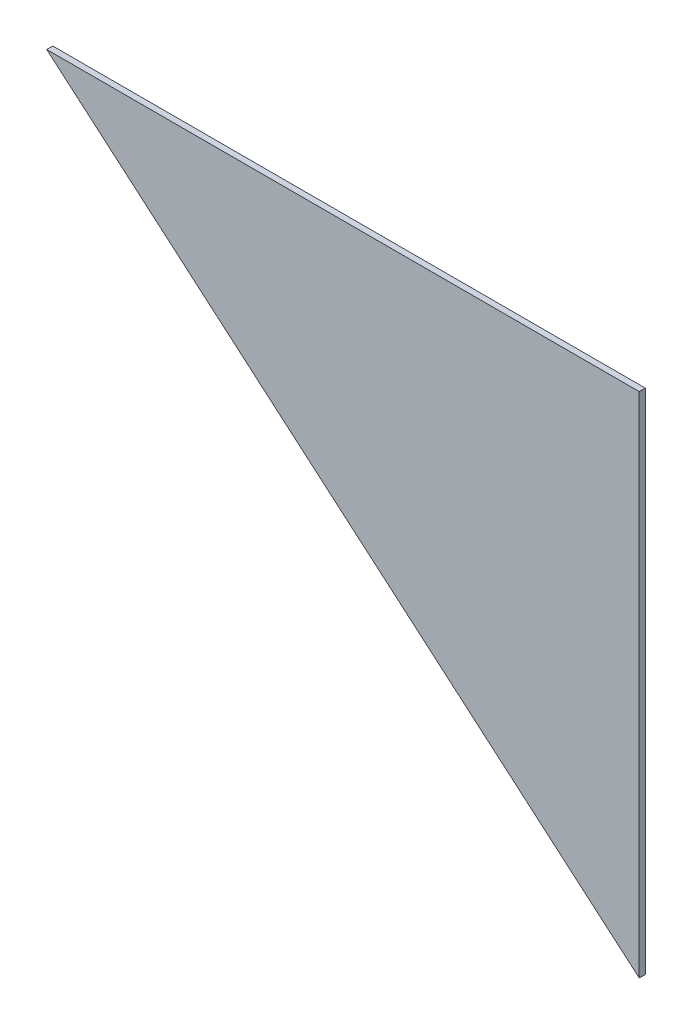
ISO-10303-21;
HEADER;
FILE_DESCRIPTION(('STEP AP214'),'2;1');
FILE_NAME('part.step','',(''),(''),'','','');
FILE_SCHEMA(('AUTOMOTIVE_DESIGN { 1 0 10303 214 1 1 1 1 }'));
ENDSEC;
DATA;
#1=APPLICATION_CONTEXT('core data for automotive mechanical design processes');
#2=APPLICATION_PROTOCOL_DEFINITION('international standard','automotive_design',2000,#1);
#3=PRODUCT_CONTEXT('',#1,'mechanical');
#4=PRODUCT('Part','Part','',(#3));
#5=PRODUCT_RELATED_PRODUCT_CATEGORY('part','',(#4));
#6=PRODUCT_DEFINITION_FORMATION('','',#4);
#7=PRODUCT_DEFINITION_CONTEXT('part definition',#1,'design');
#8=PRODUCT_DEFINITION('design','',#6,#7);
#9=PRODUCT_DEFINITION_SHAPE('','',#8);
#10=(LENGTH_UNIT() NAMED_UNIT(*) SI_UNIT(.MILLI.,.METRE.));
#11=(NAMED_UNIT(*) PLANE_ANGLE_UNIT() SI_UNIT($,.RADIAN.));
#12=(NAMED_UNIT(*) SI_UNIT($,.STERADIAN.) SOLID_ANGLE_UNIT());
#13=UNCERTAINTY_MEASURE_WITH_UNIT(LENGTH_MEASURE(1.E-05),#10,'distance_accuracy_value','');
#14=(GEOMETRIC_REPRESENTATION_CONTEXT(3) GLOBAL_UNCERTAINTY_ASSIGNED_CONTEXT((#13)) GLOBAL_UNIT_ASSIGNED_CONTEXT((#10,
#11,#12)) REPRESENTATION_CONTEXT('',''));
#15=CARTESIAN_POINT('',(0.,0.,0.));
#16=DIRECTION('',(0.,0.,1.));
#17=DIRECTION('',(1.,0.,0.));
#18=AXIS2_PLACEMENT_3D('',#15,#16,#17);
#19=CARTESIAN_POINT('',(58.4449937750399,39.370000462748,2.91549564475552));
#20=DIRECTION('',(0.,0.,1.));
#21=DIRECTION('',(1.,0.,0.));
#22=AXIS2_PLACEMENT_3D('',#19,#20,#21);
#23=PLANE('',#22);
#24=DIRECTION('',(-0.759277575899092,0.650766903535205,0.));
#25=VECTOR('',#24,1.);
#26=CARTESIAN_POINT('',(69.6425131194533,52.570000462748,2.91549564475552));
#27=LINE('',#26,#25);
#28=CARTESIAN_POINT('',(70.6199997750399,51.7322094041226,2.91549564475552));
#29=VERTEX_POINT('',#28);
#30=CARTESIAN_POINT('',(69.6425131194533,52.570000462748,2.91549564475552));
#31=VERTEX_POINT('',#30);
#32=EDGE_CURVE('E59',#29,#31,#27,.T.);
#33=ORIENTED_EDGE('',*,*,#32,.T.);
#34=DIRECTION('',(1.,0.,0.));
#35=VECTOR('',#34,1.);
#36=CARTESIAN_POINT('',(70.6199997750399,52.570000462748,2.91549564475552));
#37=LINE('',#36,#35);
#38=CARTESIAN_POINT('',(70.6199997750399,52.570000462748,2.91549564475552));
#39=VERTEX_POINT('',#38);
#40=EDGE_CURVE('E48',#31,#39,#37,.T.);
#41=ORIENTED_EDGE('',*,*,#40,.T.);
#42=DIRECTION('',(0.,-1.,0.));
#43=VECTOR('',#42,1.);
#44=CARTESIAN_POINT('',(70.6199997750399,51.7322094041226,2.91549564475552));
#45=LINE('',#44,#43);
#46=EDGE_CURVE('E20',#39,#29,#45,.T.);
#47=ORIENTED_EDGE('',*,*,#46,.T.);
#48=EDGE_LOOP('',(#33,#41,#47));
#49=FACE_BOUND('',#48,.T.);
#50=ADVANCED_FACE('F17',(#49),#23,.F.);
#51=CARTESIAN_POINT('',(70.6199997750399,51.7322094041226,2.92549564475551));
#52=DIRECTION('',(-1.,0.,0.));
#53=DIRECTION('',(0.,-1.,0.));
#54=AXIS2_PLACEMENT_3D('',#51,#52,#53);
#55=PLANE('',#54);
#56=DIRECTION('',(0.,0.,1.));
#57=VECTOR('',#56,1.);
#58=CARTESIAN_POINT('',(70.6199997750399,52.570000462748,2.92549564475551));
#59=LINE('',#58,#57);
#60=CARTESIAN_POINT('',(70.6199997750399,52.570000462748,2.92549564475551));
#61=VERTEX_POINT('',#60);
#62=EDGE_CURVE('E54',#39,#61,#59,.T.);
#63=ORIENTED_EDGE('',*,*,#62,.T.);
#64=DIRECTION('',(0.,1.,0.));
#65=VECTOR('',#64,1.);
#66=CARTESIAN_POINT('',(70.6199997750399,39.370000462748,2.92549564475551));
#67=LINE('',#66,#65);
#68=CARTESIAN_POINT('',(70.6199997750399,51.7322094041226,2.92549564475551));
#69=VERTEX_POINT('',#68);
#70=EDGE_CURVE('E68',#69,#61,#67,.T.);
#71=ORIENTED_EDGE('',*,*,#70,.F.);
#72=DIRECTION('',(0.,0.,1.));
#73=VECTOR('',#72,1.);
#74=CARTESIAN_POINT('',(70.6199997750399,51.7322094041226,2.92549564475551));
#75=LINE('',#74,#73);
#76=EDGE_CURVE('E56',#69,#29,#75,.F.);
#77=ORIENTED_EDGE('',*,*,#76,.T.);
#78=ORIENTED_EDGE('',*,*,#46,.F.);
#79=EDGE_LOOP('',(#63,#71,#77,#78));
#80=FACE_BOUND('',#79,.T.);
#81=ADVANCED_FACE('F53',(#80),#55,.F.);
#82=CARTESIAN_POINT('',(70.6199997750399,52.570000462748,2.92549564475551));
#83=DIRECTION('',(0.,-1.,0.));
#84=DIRECTION('',(1.,0.,0.));
#85=AXIS2_PLACEMENT_3D('',#82,#83,#84);
#86=PLANE('',#85);
#87=DIRECTION('',(0.,0.,1.));
#88=VECTOR('',#87,1.);
#89=CARTESIAN_POINT('',(69.6425131194533,52.570000462748,2.92549564475551));
#90=LINE('',#89,#88);
#91=CARTESIAN_POINT('',(69.6425131194533,52.570000462748,2.92549564475551));
#92=VERTEX_POINT('',#91);
#93=EDGE_CURVE('E35',#31,#92,#90,.T.);
#94=ORIENTED_EDGE('',*,*,#93,.T.);
#95=DIRECTION('',(1.,0.,0.));
#96=VECTOR('',#95,1.);
#97=CARTESIAN_POINT('',(58.4449937750399,52.570000462748,2.92549564475551));
#98=LINE('',#97,#96);
#99=EDGE_CURVE('E26',#61,#92,#98,.F.);
#100=ORIENTED_EDGE('',*,*,#99,.F.);
#101=ORIENTED_EDGE('',*,*,#62,.F.);
#102=ORIENTED_EDGE('',*,*,#40,.F.);
#103=EDGE_LOOP('',(#94,#100,#101,#102));
#104=FACE_BOUND('',#103,.T.);
#105=ADVANCED_FACE('F61',(#104),#86,.F.);
#106=CARTESIAN_POINT('',(69.6425131194533,52.570000462748,2.92549564475551));
#107=DIRECTION('',(0.650766903535205,0.759277575899092,0.));
#108=DIRECTION('',(-0.759277575899092,0.650766903535205,0.));
#109=AXIS2_PLACEMENT_3D('',#106,#107,#108);
#110=PLANE('',#109);
#111=ORIENTED_EDGE('',*,*,#76,.F.);
#112=DIRECTION('',(0.759277575899115,-0.650766903535178,0.));
#113=VECTOR('',#112,1.);
#114=CARTESIAN_POINT('',(69.6425131194533,52.570000462748,2.92549564475551));
#115=LINE('',#114,#113);
#116=EDGE_CURVE('E11',#92,#69,#115,.T.);
#117=ORIENTED_EDGE('',*,*,#116,.F.);
#118=ORIENTED_EDGE('',*,*,#93,.F.);
#119=ORIENTED_EDGE('',*,*,#32,.F.);
#120=EDGE_LOOP('',(#111,#117,#118,#119));
#121=FACE_BOUND('',#120,.T.);
#122=ADVANCED_FACE('F73',(#121),#110,.F.);
#123=CARTESIAN_POINT('',(58.4449937750399,39.370000462748,2.92549564475551));
#124=DIRECTION('',(0.,0.,1.));
#125=DIRECTION('',(1.,0.,0.));
#126=AXIS2_PLACEMENT_3D('',#123,#124,#125);
#127=PLANE('',#126);
#128=ORIENTED_EDGE('',*,*,#99,.T.);
#129=ORIENTED_EDGE('',*,*,#116,.T.);
#130=ORIENTED_EDGE('',*,*,#70,.T.);
#131=EDGE_LOOP('',(#128,#129,#130));
#132=FACE_BOUND('',#131,.T.);
#133=ADVANCED_FACE('F71',(#132),#127,.T.);
#134=CLOSED_SHELL('',(#50,#81,#105,#122,#133));
#135=MANIFOLD_SOLID_BREP('B1',#134);
#136=ADVANCED_BREP_SHAPE_REPRESENTATION('',(#18,#135),#14);
#137=SHAPE_DEFINITION_REPRESENTATION(#9,#136);
ENDSEC;
END-ISO-10303-21;
